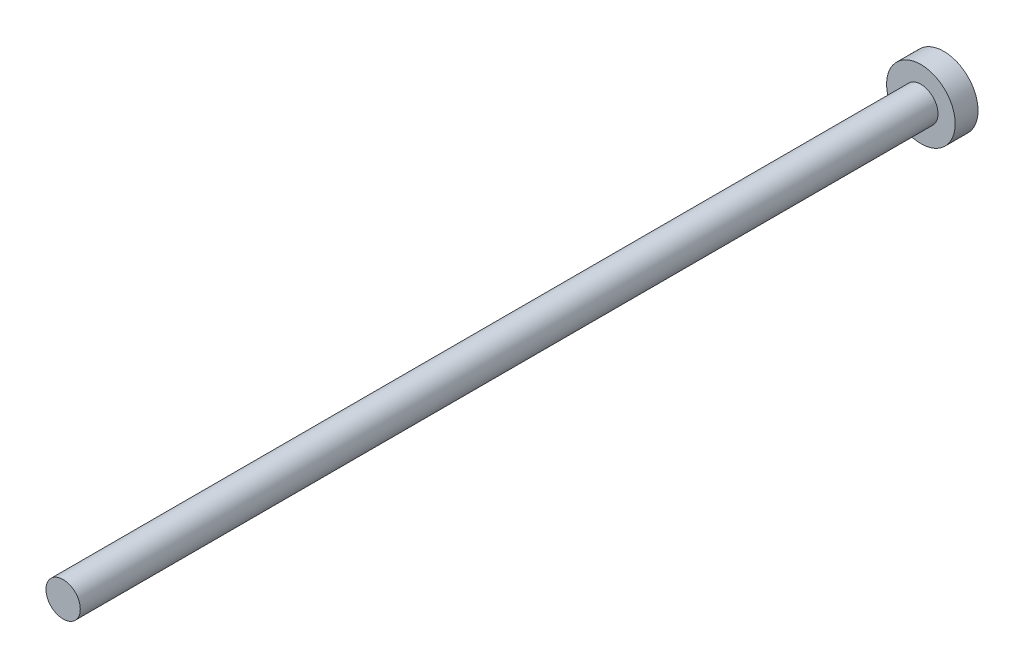
ISO-10303-21;
HEADER;
FILE_DESCRIPTION(('STEP AP214'),'2;1');
FILE_NAME('part.step','',(''),(''),'','','');
FILE_SCHEMA(('AUTOMOTIVE_DESIGN { 1 0 10303 214 1 1 1 1 }'));
ENDSEC;
DATA;
#1=APPLICATION_CONTEXT('core data for automotive mechanical design processes');
#2=APPLICATION_PROTOCOL_DEFINITION('international standard','automotive_design',2000,#1);
#3=PRODUCT_CONTEXT('',#1,'mechanical');
#4=PRODUCT('Part','Part','',(#3));
#5=PRODUCT_RELATED_PRODUCT_CATEGORY('part','',(#4));
#6=PRODUCT_DEFINITION_FORMATION('','',#4);
#7=PRODUCT_DEFINITION_CONTEXT('part definition',#1,'design');
#8=PRODUCT_DEFINITION('design','',#6,#7);
#9=PRODUCT_DEFINITION_SHAPE('','',#8);
#10=(LENGTH_UNIT() NAMED_UNIT(*) SI_UNIT(.MILLI.,.METRE.));
#11=(NAMED_UNIT(*) PLANE_ANGLE_UNIT() SI_UNIT($,.RADIAN.));
#12=(NAMED_UNIT(*) SI_UNIT($,.STERADIAN.) SOLID_ANGLE_UNIT());
#13=UNCERTAINTY_MEASURE_WITH_UNIT(LENGTH_MEASURE(1.E-05),#10,'distance_accuracy_value','');
#14=(GEOMETRIC_REPRESENTATION_CONTEXT(3) GLOBAL_UNCERTAINTY_ASSIGNED_CONTEXT((#13)) GLOBAL_UNIT_ASSIGNED_CONTEXT((#10,
#11,#12)) REPRESENTATION_CONTEXT('',''));
#15=CARTESIAN_POINT('',(0.,0.,0.));
#16=DIRECTION('',(0.,0.,1.));
#17=DIRECTION('',(1.,0.,0.));
#18=AXIS2_PLACEMENT_3D('',#15,#16,#17);
#19=CARTESIAN_POINT('',(0.,0.,75.));
#20=DIRECTION('',(0.,0.,-1.));
#21=DIRECTION('',(-1.,0.,0.));
#22=AXIS2_PLACEMENT_3D('',#19,#20,#21);
#23=CYLINDRICAL_SURFACE('',#22,1.5);
#24=CARTESIAN_POINT('',(0.,0.,75.));
#25=DIRECTION('',(0.,0.,1.));
#26=DIRECTION('',(1.,0.,0.));
#27=AXIS2_PLACEMENT_3D('',#24,#25,#26);
#28=CIRCLE('',#27,1.5);
#29=CARTESIAN_POINT('',(1.5,0.,75.));
#30=VERTEX_POINT('',#29);
#31=EDGE_CURVE('E10',#30,#30,#28,.T.);
#32=ORIENTED_EDGE('',*,*,#31,.F.);
#33=EDGE_LOOP('',(#32));
#34=FACE_BOUND('',#33,.T.);
#35=CARTESIAN_POINT('',(0.,0.,0.));
#36=DIRECTION('',(0.,0.,1.));
#37=DIRECTION('',(1.,0.,0.));
#38=AXIS2_PLACEMENT_3D('',#35,#36,#37);
#39=CIRCLE('',#38,1.5);
#40=CARTESIAN_POINT('',(1.5,0.,0.));
#41=VERTEX_POINT('',#40);
#42=EDGE_CURVE('E33',#41,#41,#39,.T.);
#43=ORIENTED_EDGE('',*,*,#42,.T.);
#44=EDGE_LOOP('',(#43));
#45=FACE_BOUND('',#44,.T.);
#46=ADVANCED_FACE('F30',(#34,#45),#23,.T.);
#47=CARTESIAN_POINT('',(0.,0.,75.));
#48=DIRECTION('',(0.,0.,1.));
#49=DIRECTION('',(1.,0.,0.));
#50=AXIS2_PLACEMENT_3D('',#47,#48,#49);
#51=PLANE('',#50);
#52=ORIENTED_EDGE('',*,*,#31,.T.);
#53=EDGE_LOOP('',(#52));
#54=FACE_BOUND('',#53,.T.);
#55=ADVANCED_FACE('F53',(#54),#51,.T.);
#56=CARTESIAN_POINT('',(0.,0.,-2.));
#57=DIRECTION('',(0.,0.,1.));
#58=DIRECTION('',(1.,0.,0.));
#59=AXIS2_PLACEMENT_3D('',#56,#57,#58);
#60=CYLINDRICAL_SURFACE('',#59,3.);
#61=CARTESIAN_POINT('',(0.,0.,-2.));
#62=DIRECTION('',(0.,0.,-1.));
#63=DIRECTION('',(-1.,0.,0.));
#64=AXIS2_PLACEMENT_3D('',#61,#62,#63);
#65=CIRCLE('',#64,3.);
#66=CARTESIAN_POINT('',(-3.,0.,-2.));
#67=VERTEX_POINT('',#66);
#68=EDGE_CURVE('E40',#67,#67,#65,.T.);
#69=ORIENTED_EDGE('',*,*,#68,.F.);
#70=EDGE_LOOP('',(#69));
#71=FACE_BOUND('',#70,.T.);
#72=CARTESIAN_POINT('',(0.,0.,0.));
#73=DIRECTION('',(0.,0.,-1.));
#74=DIRECTION('',(-1.,0.,0.));
#75=AXIS2_PLACEMENT_3D('',#72,#73,#74);
#76=CIRCLE('',#75,3.);
#77=CARTESIAN_POINT('',(-3.,0.,0.));
#78=VERTEX_POINT('',#77);
#79=EDGE_CURVE('E42',#78,#78,#76,.T.);
#80=ORIENTED_EDGE('',*,*,#79,.T.);
#81=EDGE_LOOP('',(#80));
#82=FACE_BOUND('',#81,.T.);
#83=ADVANCED_FACE('F50',(#71,#82),#60,.T.);
#84=CARTESIAN_POINT('',(0.,0.,-2.));
#85=DIRECTION('',(0.,0.,-1.));
#86=DIRECTION('',(-1.,0.,0.));
#87=AXIS2_PLACEMENT_3D('',#84,#85,#86);
#88=PLANE('',#87);
#89=ORIENTED_EDGE('',*,*,#68,.T.);
#90=EDGE_LOOP('',(#89));
#91=FACE_BOUND('',#90,.T.);
#92=ADVANCED_FACE('F48',(#91),#88,.T.);
#93=CARTESIAN_POINT('',(0.,0.,0.));
#94=DIRECTION('',(0.,0.,-1.));
#95=DIRECTION('',(-1.,0.,0.));
#96=AXIS2_PLACEMENT_3D('',#93,#94,#95);
#97=PLANE('',#96);
#98=ORIENTED_EDGE('',*,*,#42,.F.);
#99=EDGE_LOOP('',(#98));
#100=FACE_BOUND('',#99,.T.);
#101=ORIENTED_EDGE('',*,*,#79,.F.);
#102=EDGE_LOOP('',(#101));
#103=FACE_BOUND('',#102,.T.);
#104=ADVANCED_FACE('F57',(#100,#103),#97,.F.);
#105=CLOSED_SHELL('',(#46,#55,#83,#92,#104));
#106=MANIFOLD_SOLID_BREP('B2',#105);
#107=ADVANCED_BREP_SHAPE_REPRESENTATION('',(#18,#106),#14);
#108=SHAPE_DEFINITION_REPRESENTATION(#9,#107);
ENDSEC;
END-ISO-10303-21;
